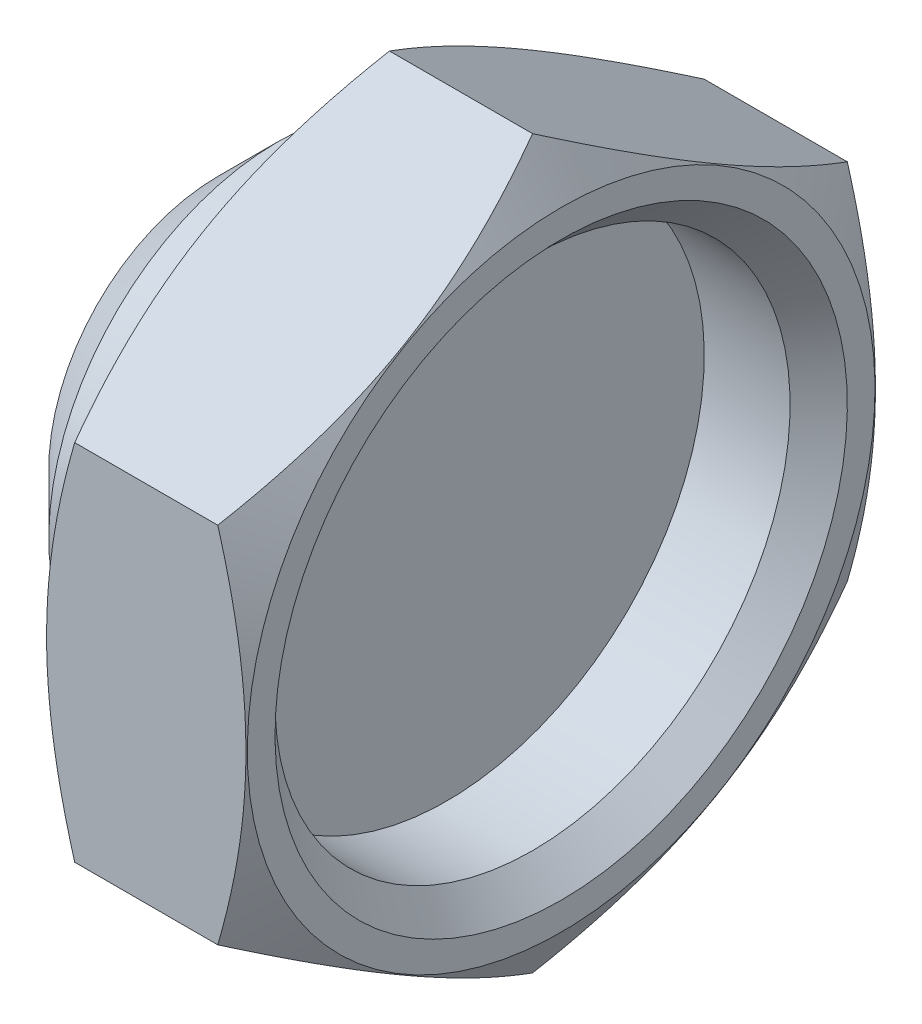
ISO-10303-21;
HEADER;
FILE_DESCRIPTION(('STEP AP214'),'2;1');
FILE_NAME('part.step','',(''),(''),'','','');
FILE_SCHEMA(('AUTOMOTIVE_DESIGN { 1 0 10303 214 1 1 1 1 }'));
ENDSEC;
DATA;
#1=APPLICATION_CONTEXT('core data for automotive mechanical design processes');
#2=APPLICATION_PROTOCOL_DEFINITION('international standard','automotive_design',2000,#1);
#3=PRODUCT_CONTEXT('',#1,'mechanical');
#4=PRODUCT('Part','Part','',(#3));
#5=PRODUCT_RELATED_PRODUCT_CATEGORY('part','',(#4));
#6=PRODUCT_DEFINITION_FORMATION('','',#4);
#7=PRODUCT_DEFINITION_CONTEXT('part definition',#1,'design');
#8=PRODUCT_DEFINITION('design','',#6,#7);
#9=PRODUCT_DEFINITION_SHAPE('','',#8);
#10=(LENGTH_UNIT() NAMED_UNIT(*) SI_UNIT(.MILLI.,.METRE.));
#11=(NAMED_UNIT(*) PLANE_ANGLE_UNIT() SI_UNIT($,.RADIAN.));
#12=(NAMED_UNIT(*) SI_UNIT($,.STERADIAN.) SOLID_ANGLE_UNIT());
#13=UNCERTAINTY_MEASURE_WITH_UNIT(LENGTH_MEASURE(1.E-05),#10,'distance_accuracy_value','');
#14=(GEOMETRIC_REPRESENTATION_CONTEXT(3) GLOBAL_UNCERTAINTY_ASSIGNED_CONTEXT((#13)) GLOBAL_UNIT_ASSIGNED_CONTEXT((#10,
#11,#12)) REPRESENTATION_CONTEXT('',''));
#15=CARTESIAN_POINT('',(0.,0.,0.));
#16=DIRECTION('',(0.,0.,1.));
#17=DIRECTION('',(1.,0.,0.));
#18=AXIS2_PLACEMENT_3D('',#15,#16,#17);
#19=CARTESIAN_POINT('',(-3.5,0.,0.));
#20=DIRECTION('',(1.,0.,0.));
#21=DIRECTION('',(0.,1.,0.));
#22=AXIS2_PLACEMENT_3D('',#19,#20,#21);
#23=CONICAL_SURFACE('',#22,5.48397459621555,1.0471975511966);
#24=CARTESIAN_POINT('',(-3.5,0.,0.));
#25=DIRECTION('',(1.,0.,0.));
#26=DIRECTION('',(0.,1.,0.));
#27=AXIS2_PLACEMENT_3D('',#24,#25,#26);
#28=CIRCLE('',#27,5.48397459621555);
#29=CARTESIAN_POINT('',(-3.5,5.48397459621555,0.));
#30=VERTEX_POINT('',#29);
#31=EDGE_CURVE('E239',#30,#30,#28,.T.);
#32=ORIENTED_EDGE('',*,*,#31,.T.);
#33=EDGE_LOOP('',(#32));
#34=FACE_BOUND('',#33,.T.);
#35=CARTESIAN_POINT('',(-0.860222517226305,-8.4193438078015,5.49926131403115));
#36=CARTESIAN_POINT('',(-0.976894162451002,-8.17790466876837,5.49926131403115));
#37=CARTESIAN_POINT('',(-1.09240561924435,-7.93589454758182,5.49926131403115));
#38=CARTESIAN_POINT('',(-1.32044515697956,-7.45042360911133,5.49926131403116));
#39=CARTESIAN_POINT('',(-1.43297272109457,-7.20696254934565,5.49926131403116));
#40=CARTESIAN_POINT('',(-1.65497454300229,-6.71696524052617,5.49926131403116));
#41=CARTESIAN_POINT('',(-1.76442763135321,-6.47041936552914,5.49926131403116));
#42=CARTESIAN_POINT('',(-1.97863076475805,-5.97530075878895,5.49926131403116));
#43=CARTESIAN_POINT('',(-2.08338105506412,-5.72672813354206,5.49926131403116));
#44=CARTESIAN_POINT('',(-2.2881692769292,-5.2240806083909,5.49926131403116));
#45=CARTESIAN_POINT('',(-2.3881337348326,-4.96997560933001,5.49926131403116));
#46=CARTESIAN_POINT('',(-2.58023034403244,-4.45876779132847,5.49926131403117));
#47=CARTESIAN_POINT('',(-2.67236162377843,-4.20166464241133,5.49926131403117));
#48=CARTESIAN_POINT('',(-2.84631569619457,-3.68458087251413,5.49926131403117));
#49=CARTESIAN_POINT('',(-2.92816041530891,-3.42460770263987,5.49926131403117));
#50=CARTESIAN_POINT('',(-3.07888156914745,-2.90096287239082,5.49926131403117));
#51=CARTESIAN_POINT('',(-3.14776210615687,-2.63729241043142,5.49926131403117));
#52=CARTESIAN_POINT('',(-3.26921381728038,-2.10608510175159,5.49926131403117));
#53=CARTESIAN_POINT('',(-3.32178058367544,-1.83854723051801,5.49926131403118));
#54=CARTESIAN_POINT('',(-3.40705120364587,-1.30020980488695,5.49926131403118));
#55=CARTESIAN_POINT('',(-3.43975503830669,-1.02941024738376,5.49926131403118));
#56=CARTESIAN_POINT('',(-3.47181708617323,-0.622780704300727,5.49926131403118));
#57=CARTESIAN_POINT('',(-3.47967381699046,-0.487586462507965,5.49926131403118));
#58=CARTESIAN_POINT('',(-3.48965869139436,-0.216980373104561,5.49926131403118));
#59=CARTESIAN_POINT('',(-3.49178690924103,-0.0815685283375243,5.49926131403118));
#60=CARTESIAN_POINT('',(-3.49025755488634,0.189183327059158,5.49926131403118));
#61=CARTESIAN_POINT('',(-3.48660160493979,0.324523347184391,5.49926131403118));
#62=CARTESIAN_POINT('',(-3.47359652868538,0.59493180011065,5.49926131403118));
#63=CARTESIAN_POINT('',(-3.46424711852415,0.73000021903384,5.49926131403118));
#64=CARTESIAN_POINT('',(-3.43487817672258,1.0574036937653,5.49926131403119));
#65=CARTESIAN_POINT('',(-3.41200359644678,1.24948678913167,5.49926131403119));
#66=CARTESIAN_POINT('',(-3.35600923475458,1.63218028754172,5.49926131403119));
#67=CARTESIAN_POINT('',(-3.32288665600114,1.82279027390057,5.49926131403119));
#68=CARTESIAN_POINT('',(-3.24757100636626,2.20238051590384,5.49926131403119));
#69=CARTESIAN_POINT('',(-3.20536935624085,2.39135905301,5.49926131403119));
#70=CARTESIAN_POINT('',(-3.11318313045468,2.76737142315785,5.49926131403119));
#71=CARTESIAN_POINT('',(-3.06319928812899,2.95440543766692,5.49926131403119));
#72=CARTESIAN_POINT('',(-2.95533832018987,3.33113367099198,5.49926131403119));
#73=CARTESIAN_POINT('',(-2.8972978015811,3.52078078527209,5.49926131403119));
#74=CARTESIAN_POINT('',(-2.77548463552444,3.8980704136669,5.4992613140312));
#75=CARTESIAN_POINT('',(-2.71171594273515,4.08571421222063,5.4992613140312));
#76=CARTESIAN_POINT('',(-2.57976341412777,4.45824423871632,5.4992613140312));
#77=CARTESIAN_POINT('',(-2.51160645460141,4.64314004377355,5.4992613140312));
#78=CARTESIAN_POINT('',(-2.37129379384592,5.01149734089483,5.4992613140312));
#79=CARTESIAN_POINT('',(-2.29913647542953,5.19495821816797,5.4992613140312));
#80=CARTESIAN_POINT('',(-2.2253747585014,5.37775271726779,5.4992613140312));
#81=B_SPLINE_CURVE_WITH_KNOTS('',3,(#35,#36,#37,#38,#39,#40,#41,#42,#43,#44,#45,#46,#47,#48,#49,
#50,#51,#52,#53,#54,#55,#56,#57,#58,#59,#60,#61,#62,#63,#64,#65,#66,#67,#68,#69,#70,#71,#72,#73,
#74,#75,#76,#77,#78,#79,#80),.UNSPECIFIED.,.F.,.F.,(4,2,2,2,2,2,2,2,2,2,2,2,2,2,2,2,2,2,2,2,2,2,
4),(0.,0.804464769607668,1.60906797871341,2.41827774538096,3.22744526241143,4.04652821302815,
4.86570217912161,5.68309929298247,6.50023731957803,7.31759593193316,8.13495532262018,
8.54111924461276,8.94727790138578,9.35332266518992,9.7593876744355,10.3393855449576,
10.9195418740392,11.5002488472955,12.0809011321908,12.6757805026481,13.2702522869463,
13.8613774537498,14.4527433568325),.UNSPECIFIED.);
#82=CARTESIAN_POINT('',(-2.99999999999999,3.17499999999999,5.49926131403119));
#83=VERTEX_POINT('',#82);
#84=CARTESIAN_POINT('',(-2.99999999999999,-3.17500000000003,5.49926131403117));
#85=VERTEX_POINT('',#84);
#86=EDGE_CURVE('E90',#83,#85,#81,.F.);
#87=ORIENTED_EDGE('',*,*,#86,.F.);
#88=CARTESIAN_POINT('',(-2.99993333151493,6.35011547005384,-0.000199999999999895));
#89=CARTESIAN_POINT('',(-3.04022119966316,6.28032517689997,0.120680333617623));
#90=CARTESIAN_POINT('',(-3.07868069530511,6.21027467153095,0.24201136801264));
#91=CARTESIAN_POINT('',(-3.15143936507394,6.06960477298626,0.485658779387599));
#92=CARTESIAN_POINT('',(-3.18573674449189,5.99898514830378,0.60797555734911));
#93=CARTESIAN_POINT('',(-3.28171252031528,5.78599554726789,0.976884367827086));
#94=CARTESIAN_POINT('',(-3.33630269976675,5.64278482209128,1.22493262002176));
#95=CARTESIAN_POINT('',(-3.40031657213475,5.42847257332278,1.59613232357314));
#96=CARTESIAN_POINT('',(-3.41855236126598,5.35801140654487,1.71817464439306));
#97=CARTESIAN_POINT('',(-3.44913133922799,5.21677068514506,1.96281074995521));
#98=CARTESIAN_POINT('',(-3.46147504870401,5.14599115921264,2.08540448500581));
#99=CARTESIAN_POINT('',(-3.47995528401636,5.00430916848738,2.33080489145946));
#100=CARTESIAN_POINT('',(-3.48609885449138,4.93340693511676,2.45361116202748));
#101=CARTESIAN_POINT('',(-3.49205366681356,4.79154087441145,2.69933038703873));
#102=CARTESIAN_POINT('',(-3.4918651042647,4.7205770490471,2.82224333806923));
#103=CARTESIAN_POINT('',(-3.48264444424823,4.52615642554051,3.15898973602185));
#104=CARTESIAN_POINT('',(-3.46716346768017,4.40276326110671,3.37271296612791));
#105=CARTESIAN_POINT('',(-3.41807192549598,4.15679650457315,3.79873988541694));
#106=CARTESIAN_POINT('',(-3.38444457865597,4.03422377758039,4.01104207619068));
#107=CARTESIAN_POINT('',(-3.30038548532606,3.78776196226402,4.43792646244428));
#108=CARTESIAN_POINT('',(-3.24959756859613,3.66390397476229,4.65245478972052));
#109=CARTESIAN_POINT('',(-3.13432930302382,3.4180351338268,5.07831211421885));
#110=CARTESIAN_POINT('',(-3.06987603241419,3.29602113131975,5.28964656579589));
#111=CARTESIAN_POINT('',(-2.99993333151493,3.17488452994615,5.49946131403119));
#112=B_SPLINE_CURVE_WITH_KNOTS('',3,(#88,#89,#90,#91,#92,#93,#94,#95,#96,#97,#98,#99,#100,#101,
#102,#103,#104,#105,#106,#107,#108,#109,#110,#111),.UNSPECIFIED.,.F.,.F.,(4,2,2,2,2,2,2,2,2,2,2,
4),(0.,0.435800799065846,0.871788853166128,1.74557669465936,2.17176914928739,2.59792393705013,
3.02359397795515,3.44925086963047,4.1902875016232,4.93201059960052,5.69018471432645,
6.44687029946132),.UNSPECIFIED.);
#113=CARTESIAN_POINT('',(-2.99999999999999,6.35,0.));
#114=VERTEX_POINT('',#113);
#115=EDGE_CURVE('E98',#114,#83,#112,.T.);
#116=ORIENTED_EDGE('',*,*,#115,.F.);
#117=CARTESIAN_POINT('',(-2.99993333151493,3.17488452994623,-5.49946131403115));
#118=CARTESIAN_POINT('',(-3.04022119966316,3.24467482310009,-5.37858098041352));
#119=CARTESIAN_POINT('',(-3.07868069530511,3.31472532846911,-5.25724994601851));
#120=CARTESIAN_POINT('',(-3.15143936507394,3.4553952270138,-5.01360253464355));
#121=CARTESIAN_POINT('',(-3.18573674449189,3.52601485169628,-4.89128575668203));
#122=CARTESIAN_POINT('',(-3.28171252031528,3.73900445273217,-4.52237694620406));
#123=CARTESIAN_POINT('',(-3.33630269976674,3.88221517790877,-4.27432869400938));
#124=CARTESIAN_POINT('',(-3.40031657213474,4.09652742667727,-3.903128990458));
#125=CARTESIAN_POINT('',(-3.41855236126597,4.16698859345518,-3.78108666963808));
#126=CARTESIAN_POINT('',(-3.44913133922798,4.30822931485499,-3.53645056407593));
#127=CARTESIAN_POINT('',(-3.461475048704,4.37900884078741,-3.41385682902533));
#128=CARTESIAN_POINT('',(-3.47995528401635,4.52069083151267,-3.16845642257167));
#129=CARTESIAN_POINT('',(-3.48609885449137,4.59159306488329,-3.04565015200365));
#130=CARTESIAN_POINT('',(-3.49205366681355,4.7334591255886,-2.79993092699241));
#131=CARTESIAN_POINT('',(-3.49186510426469,4.80442295095295,-2.67701797596191));
#132=CARTESIAN_POINT('',(-3.48264444424822,4.99884357445953,-2.34027157800928));
#133=CARTESIAN_POINT('',(-3.46716346768015,5.12223673889333,-2.12654834790324));
#134=CARTESIAN_POINT('',(-3.41807192549596,5.36820349542687,-1.70052142861421));
#135=CARTESIAN_POINT('',(-3.38444457865596,5.49077622241963,-1.48821923784048));
#136=CARTESIAN_POINT('',(-3.30038548532605,5.73723803773599,-1.06133485158688));
#137=CARTESIAN_POINT('',(-3.24959756859612,5.86109602523772,-0.846806524310652));
#138=CARTESIAN_POINT('',(-3.13432930302381,6.1069648661732,-0.420949199812329));
#139=CARTESIAN_POINT('',(-3.06987603241419,6.22897886868024,-0.209614748235293));
#140=CARTESIAN_POINT('',(-2.99993333151493,6.35011547005384,0.00019999999999955));
#141=B_SPLINE_CURVE_WITH_KNOTS('',3,(#117,#118,#119,#120,#121,#122,#123,#124,#125,#126,#127,
#128,#129,#130,#131,#132,#133,#134,#135,#136,#137,#138,#139,#140),.UNSPECIFIED.,.F.,.F.,(4,2,2,
2,2,2,2,2,2,2,2,4),(0.,0.435800799065847,0.871788853166128,1.74557669465936,2.17176914928739,
2.59792393705013,3.02359397795515,3.44925086963047,4.19028750162318,4.93201059960048,
5.69018471432639,6.44687029946124),.UNSPECIFIED.);
#142=CARTESIAN_POINT('',(-2.99999999999999,3.17500000000006,-5.49926131403115));
#143=VERTEX_POINT('',#142);
#144=EDGE_CURVE('E199',#143,#114,#141,.T.);
#145=ORIENTED_EDGE('',*,*,#144,.F.);
#146=CARTESIAN_POINT('',(-0.860222517226304,-8.41934380780143,-5.49926131403127));
#147=CARTESIAN_POINT('',(-0.976894162451,-8.1779046687683,-5.49926131403127));
#148=CARTESIAN_POINT('',(-1.09240561924435,-7.93589454758175,-5.49926131403126));
#149=CARTESIAN_POINT('',(-1.32044515697955,-7.45042360911126,-5.49926131403126));
#150=CARTESIAN_POINT('',(-1.43297272109457,-7.20696254934557,-5.49926131403126));
#151=CARTESIAN_POINT('',(-1.65497454300229,-6.7169652405261,-5.49926131403125));
#152=CARTESIAN_POINT('',(-1.76442763135321,-6.47041936552907,-5.49926131403125));
#153=CARTESIAN_POINT('',(-1.97863076475805,-5.97530075878888,-5.49926131403124));
#154=CARTESIAN_POINT('',(-2.08338105506412,-5.72672813354198,-5.49926131403124));
#155=CARTESIAN_POINT('',(-2.28816927692919,-5.22408060839082,-5.49926131403124));
#156=CARTESIAN_POINT('',(-2.38813373483259,-4.96997560932994,-5.49926131403123));
#157=CARTESIAN_POINT('',(-2.58023034403244,-4.45876779132839,-5.49926131403123));
#158=CARTESIAN_POINT('',(-2.67236162377843,-4.20166464241126,-5.49926131403122));
#159=CARTESIAN_POINT('',(-2.84631569619457,-3.68458087251405,-5.49926131403122));
#160=CARTESIAN_POINT('',(-2.9281604153089,-3.4246077026398,-5.49926131403122));
#161=CARTESIAN_POINT('',(-3.07888156914745,-2.90096287239075,-5.49926131403121));
#162=CARTESIAN_POINT('',(-3.14776210615687,-2.63729241043135,-5.49926131403121));
#163=CARTESIAN_POINT('',(-3.26921381728038,-2.10608510175151,-5.4992613140312));
#164=CARTESIAN_POINT('',(-3.32178058367544,-1.83854723051794,-5.4992613140312));
#165=CARTESIAN_POINT('',(-3.40705120364587,-1.30020980488688,-5.4992613140312));
#166=CARTESIAN_POINT('',(-3.43975503830669,-1.02941024738369,-5.49926131403119));
#167=CARTESIAN_POINT('',(-3.47181708617323,-0.622780704300652,-5.49926131403119));
#168=CARTESIAN_POINT('',(-3.47967381699046,-0.48758646250789,-5.49926131403119));
#169=CARTESIAN_POINT('',(-3.48965869139436,-0.216980373104486,-5.49926131403118));
#170=CARTESIAN_POINT('',(-3.49178690924103,-0.0815685283374487,-5.49926131403118));
#171=CARTESIAN_POINT('',(-3.49025755488634,0.189183327059233,-5.49926131403118));
#172=CARTESIAN_POINT('',(-3.48660160493979,0.324523347184466,-5.49926131403118));
#173=CARTESIAN_POINT('',(-3.47359652868538,0.594931800110726,-5.49926131403118));
#174=CARTESIAN_POINT('',(-3.46424711852415,0.730000219033916,-5.49926131403117));
#175=CARTESIAN_POINT('',(-3.43487817672258,1.05740369376537,-5.49926131403117));
#176=CARTESIAN_POINT('',(-3.41200359644678,1.24948678913174,-5.49926131403117));
#177=CARTESIAN_POINT('',(-3.35600923475458,1.63218028754179,-5.49926131403117));
#178=CARTESIAN_POINT('',(-3.32288665600114,1.82279027390064,-5.49926131403116));
#179=CARTESIAN_POINT('',(-3.24757100636626,2.20238051590392,-5.49926131403116));
#180=CARTESIAN_POINT('',(-3.20536935624085,2.39135905301008,-5.49926131403116));
#181=CARTESIAN_POINT('',(-3.11318313045468,2.76737142315792,-5.49926131403115));
#182=CARTESIAN_POINT('',(-3.06319928812899,2.95440543766699,-5.49926131403115));
#183=CARTESIAN_POINT('',(-2.95533832018987,3.33113367099206,-5.49926131403115));
#184=CARTESIAN_POINT('',(-2.8972978015811,3.52078078527217,-5.49926131403114));
#185=CARTESIAN_POINT('',(-2.77548463552444,3.89807041366698,-5.49926131403114));
#186=CARTESIAN_POINT('',(-2.71171594273515,4.08571421222071,-5.49926131403114));
#187=CARTESIAN_POINT('',(-2.57976341412777,4.45824423871639,-5.49926131403114));
#188=CARTESIAN_POINT('',(-2.51160645460141,4.64314004377363,-5.49926131403113));
#189=CARTESIAN_POINT('',(-2.37129379384592,5.0114973408949,-5.49926131403113));
#190=CARTESIAN_POINT('',(-2.29913647542953,5.19495821816804,-5.49926131403113));
#191=CARTESIAN_POINT('',(-2.2253747585014,5.37775271726787,-5.49926131403113));
#192=B_SPLINE_CURVE_WITH_KNOTS('',3,(#146,#147,#148,#149,#150,#151,#152,#153,#154,#155,#156,
#157,#158,#159,#160,#161,#162,#163,#164,#165,#166,#167,#168,#169,#170,#171,#172,#173,#174,#175,
#176,#177,#178,#179,#180,#181,#182,#183,#184,#185,#186,#187,#188,#189,#190,#191),.UNSPECIFIED.,
.F.,.F.,(4,2,2,2,2,2,2,2,2,2,2,2,2,2,2,2,2,2,2,2,2,2,4),(0.,0.804464769607665,1.60906797871341,
2.41827774538096,3.22744526241143,4.04652821302815,4.86570217912161,5.68309929298247,
6.50023731957803,7.31759593193316,8.13495532262019,8.54111924461276,8.94727790138579,
9.35332266518992,9.75938767443551,10.3393855449576,10.9195418740392,11.5002488472955,
12.0809011321908,12.6757805026481,13.2702522869463,13.8613774537498,14.4527433568325),.UNSPECIFIED.);
#193=CARTESIAN_POINT('',(-2.99999999999999,-3.17499999999995,-5.49926131403121));
#194=VERTEX_POINT('',#193);
#195=EDGE_CURVE('E111',#194,#143,#192,.T.);
#196=ORIENTED_EDGE('',*,*,#195,.F.);
#197=CARTESIAN_POINT('',(-2.99993333151493,-6.35011547005384,0.000199999999955765));
#198=CARTESIAN_POINT('',(-3.04022119966316,-6.28032517689997,-0.120680333617667));
#199=CARTESIAN_POINT('',(-3.0786806953051,-6.21027467153095,-0.242011368012683));
#200=CARTESIAN_POINT('',(-3.15143936507394,-6.06960477298626,-0.485658779387641));
#201=CARTESIAN_POINT('',(-3.18573674449189,-5.99898514830377,-0.607975557349151));
#202=CARTESIAN_POINT('',(-3.28171252031528,-5.78599554726789,-0.976884367827126));
#203=CARTESIAN_POINT('',(-3.33630269976674,-5.64278482209127,-1.2249326200218));
#204=CARTESIAN_POINT('',(-3.40031657213475,-5.42847257332277,-1.59613232357318));
#205=CARTESIAN_POINT('',(-3.41855236126598,-5.35801140654486,-1.7181746443931));
#206=CARTESIAN_POINT('',(-3.44913133922799,-5.21677068514505,-1.96281074995525));
#207=CARTESIAN_POINT('',(-3.46147504870401,-5.14599115921263,-2.08540448500584));
#208=CARTESIAN_POINT('',(-3.47995528401636,-5.00430916848736,-2.3308048914595));
#209=CARTESIAN_POINT('',(-3.48609885449137,-4.93340693511674,-2.45361116202752));
#210=CARTESIAN_POINT('',(-3.49205366681356,-4.79154087441143,-2.69933038703876));
#211=CARTESIAN_POINT('',(-3.4918651042647,-4.72057704904708,-2.82224333806926));
#212=CARTESIAN_POINT('',(-3.48264444424823,-4.52615642554049,-3.15898973602189));
#213=CARTESIAN_POINT('',(-3.46716346768017,-4.40276326110668,-3.37271296612794));
#214=CARTESIAN_POINT('',(-3.41807192549598,-4.15679650457313,-3.79873988541697));
#215=CARTESIAN_POINT('',(-3.38444457865597,-4.03422377758036,-4.01104207619071));
#216=CARTESIAN_POINT('',(-3.30038548532606,-3.78776196226399,-4.43792646244431));
#217=CARTESIAN_POINT('',(-3.24959756859613,-3.66390397476225,-4.65245478972055));
#218=CARTESIAN_POINT('',(-3.13432930302381,-3.41803513382676,-5.07831211421888));
#219=CARTESIAN_POINT('',(-3.06987603241419,-3.29602113131972,-5.28964656579592));
#220=CARTESIAN_POINT('',(-2.99993333151493,-3.17488452994611,-5.49946131403121));
#221=B_SPLINE_CURVE_WITH_KNOTS('',3,(#197,#198,#199,#200,#201,#202,#203,#204,#205,#206,#207,
#208,#209,#210,#211,#212,#213,#214,#215,#216,#217,#218,#219,#220),.UNSPECIFIED.,.F.,.F.,(4,2,2,
2,2,2,2,2,2,2,2,4),(0.,0.435800799065845,0.871788853166127,1.74557669465936,2.17176914928739,
2.59792393705013,3.02359397795515,3.44925086963047,4.1902875016232,4.93201059960052,
5.69018471432645,6.44687029946132),.UNSPECIFIED.);
#222=CARTESIAN_POINT('',(-2.99999999999999,-6.35,0.));
#223=VERTEX_POINT('',#222);
#224=EDGE_CURVE('E181',#223,#194,#221,.T.);
#225=ORIENTED_EDGE('',*,*,#224,.F.);
#226=CARTESIAN_POINT('',(-2.99993333151493,-3.17488452994619,5.49946131403117));
#227=CARTESIAN_POINT('',(-3.04022119966316,-3.24467482310005,5.37858098041355));
#228=CARTESIAN_POINT('',(-3.07868069530511,-3.31472532846907,5.25724994601853));
#229=CARTESIAN_POINT('',(-3.15143936507394,-3.45539522701376,5.01360253464357));
#230=CARTESIAN_POINT('',(-3.18573674449189,-3.52601485169624,4.89128575668206));
#231=CARTESIAN_POINT('',(-3.28171252031528,-3.73900445273213,4.52237694620408));
#232=CARTESIAN_POINT('',(-3.33630269976674,-3.88221517790874,4.27432869400941));
#233=CARTESIAN_POINT('',(-3.40031657213475,-4.09652742667723,3.90312899045803));
#234=CARTESIAN_POINT('',(-3.41855236126598,-4.16698859345514,3.7810866696381));
#235=CARTESIAN_POINT('',(-3.44913133922799,-4.30822931485495,3.53645056407595));
#236=CARTESIAN_POINT('',(-3.46147504870401,-4.37900884078737,3.41385682902535));
#237=CARTESIAN_POINT('',(-3.47995528401636,-4.52069083151263,3.1684564225717));
#238=CARTESIAN_POINT('',(-3.48609885449138,-4.59159306488325,3.04565015200368));
#239=CARTESIAN_POINT('',(-3.49205366681356,-4.73345912558856,2.79993092699243));
#240=CARTESIAN_POINT('',(-3.4918651042647,-4.80442295095291,2.67701797596193));
#241=CARTESIAN_POINT('',(-3.48264444424823,-4.99884357445949,2.3402715780093));
#242=CARTESIAN_POINT('',(-3.46716346768017,-5.1222367388933,2.12654834790325));
#243=CARTESIAN_POINT('',(-3.41807192549598,-5.36820349542685,1.70052142861421));
#244=CARTESIAN_POINT('',(-3.38444457865597,-5.49077622241961,1.48821923784048));
#245=CARTESIAN_POINT('',(-3.30038548532606,-5.73723803773597,1.06133485158687));
#246=CARTESIAN_POINT('',(-3.24959756859613,-5.86109602523771,0.84680652431063));
#247=CARTESIAN_POINT('',(-3.13432930302381,-6.10696486617319,0.420949199812295));
#248=CARTESIAN_POINT('',(-3.06987603241419,-6.22897886868024,0.209614748235254));
#249=CARTESIAN_POINT('',(-2.99993333151493,-6.35011547005384,-0.000200000000044996));
#250=B_SPLINE_CURVE_WITH_KNOTS('',3,(#226,#227,#228,#229,#230,#231,#232,#233,#234,#235,#236,
#237,#238,#239,#240,#241,#242,#243,#244,#245,#246,#247,#248,#249),.UNSPECIFIED.,.F.,.F.,(4,2,2,
2,2,2,2,2,2,2,2,4),(0.,0.435800799065844,0.871788853166127,1.74557669465936,2.17176914928739,
2.59792393705013,3.02359397795515,3.44925086963047,4.1902875016232,4.93201059960052,
5.69018471432645,6.44687029946132),.UNSPECIFIED.);
#251=EDGE_CURVE('E107',#85,#223,#250,.T.);
#252=ORIENTED_EDGE('',*,*,#251,.F.);
#253=EDGE_LOOP('',(#87,#116,#145,#196,#225,#252));
#254=FACE_BOUND('',#253,.T.);
#255=ADVANCED_FACE('F35',(#34,#254),#23,.T.);
#256=CARTESIAN_POINT('',(-0.500000000000001,0.,0.));
#257=DIRECTION('',(-1.,0.,0.));
#258=DIRECTION('',(0.,-1.,0.));
#259=AXIS2_PLACEMENT_3D('',#256,#257,#258);
#260=CONICAL_SURFACE('',#259,6.35,1.0471975511966);
#261=CARTESIAN_POINT('',(0.,0.,0.));
#262=DIRECTION('',(1.,0.,0.));
#263=DIRECTION('',(0.,1.,0.));
#264=AXIS2_PLACEMENT_3D('',#261,#262,#263);
#265=CIRCLE('',#264,5.48397459621555);
#266=CARTESIAN_POINT('',(0.,5.48397459621555,0.));
#267=VERTEX_POINT('',#266);
#268=EDGE_CURVE('E242',#267,#267,#265,.T.);
#269=ORIENTED_EDGE('',*,*,#268,.F.);
#270=EDGE_LOOP('',(#269));
#271=FACE_BOUND('',#270,.T.);
#272=CARTESIAN_POINT('',(-2.63977748277365,-8.4193438078015,5.49926131403115));
#273=CARTESIAN_POINT('',(-2.52310583754896,-8.17790466876837,5.49926131403115));
#274=CARTESIAN_POINT('',(-2.40759438075561,-7.93589454758183,5.49926131403115));
#275=CARTESIAN_POINT('',(-2.17955484302041,-7.45042360911133,5.49926131403116));
#276=CARTESIAN_POINT('',(-2.06702727890539,-7.20696254934565,5.49926131403116));
#277=CARTESIAN_POINT('',(-1.84502545699768,-6.71696524052617,5.49926131403116));
#278=CARTESIAN_POINT('',(-1.73557236864676,-6.47041936552914,5.49926131403116));
#279=CARTESIAN_POINT('',(-1.52136923524192,-5.97530075878895,5.49926131403116));
#280=CARTESIAN_POINT('',(-1.41661894493586,-5.72672813354205,5.49926131403116));
#281=CARTESIAN_POINT('',(-1.21183072307078,-5.22408060839089,5.49926131403116));
#282=CARTESIAN_POINT('',(-1.11186626516738,-4.96997560933001,5.49926131403116));
#283=CARTESIAN_POINT('',(-0.919769655967547,-4.45876779132846,5.49926131403117));
#284=CARTESIAN_POINT('',(-0.827638376221558,-4.20166464241133,5.49926131403117));
#285=CARTESIAN_POINT('',(-0.653684303805419,-3.68458087251413,5.49926131403117));
#286=CARTESIAN_POINT('',(-0.571839584691085,-3.42460770263987,5.49926131403117));
#287=CARTESIAN_POINT('',(-0.421118430852542,-2.90096287239082,5.49926131403117));
#288=CARTESIAN_POINT('',(-0.35223789384312,-2.63729241043142,5.49926131403117));
#289=CARTESIAN_POINT('',(-0.230786182719616,-2.10608510175159,5.49926131403117));
#290=CARTESIAN_POINT('',(-0.178219416324561,-1.83854723051801,5.49926131403118));
#291=CARTESIAN_POINT('',(-0.0929487963541297,-1.30020980488696,5.49926131403118));
#292=CARTESIAN_POINT('',(-0.0602449616933108,-1.02941024738377,5.49926131403118));
#293=CARTESIAN_POINT('',(-0.028182913826768,-0.622780704300733,5.49926131403118));
#294=CARTESIAN_POINT('',(-0.0203261830095407,-0.487586462507971,5.49926131403118));
#295=CARTESIAN_POINT('',(-0.0103413086056419,-0.216980373104568,5.49926131403118));
#296=CARTESIAN_POINT('',(-0.00821309075896969,-0.081568528337532,5.49926131403118));
#297=CARTESIAN_POINT('',(-0.00974244511366106,0.189183327059149,5.49926131403118));
#298=CARTESIAN_POINT('',(-0.0133983950602101,0.324523347184382,5.49926131403118));
#299=CARTESIAN_POINT('',(-0.0264034713146173,0.594931800110642,5.49926131403118));
#300=CARTESIAN_POINT('',(-0.0357528814758546,0.730000219033832,5.49926131403118));
#301=CARTESIAN_POINT('',(-0.065121823277417,1.05740369376529,5.49926131403119));
#302=CARTESIAN_POINT('',(-0.087996403553221,1.24948678913167,5.49926131403119));
#303=CARTESIAN_POINT('',(-0.143990765245416,1.63218028754173,5.49926131403119));
#304=CARTESIAN_POINT('',(-0.177113343998859,1.82279027390058,5.49926131403119));
#305=CARTESIAN_POINT('',(-0.25242899363374,2.20238051590386,5.49926131403119));
#306=CARTESIAN_POINT('',(-0.294630643759152,2.39135905301003,5.49926131403119));
#307=CARTESIAN_POINT('',(-0.386816869545329,2.76737142315788,5.49926131403119));
#308=CARTESIAN_POINT('',(-0.436800711871017,2.95440543766695,5.49926131403119));
#309=CARTESIAN_POINT('',(-0.544661679810134,3.33113367099202,5.49926131403119));
#310=CARTESIAN_POINT('',(-0.602702198418907,3.52078078527214,5.49926131403119));
#311=CARTESIAN_POINT('',(-0.724515364475567,3.89807041366695,5.4992613140312));
#312=CARTESIAN_POINT('',(-0.788284057264855,4.08571421222069,5.4992613140312));
#313=CARTESIAN_POINT('',(-0.920236585872237,4.45824423871638,5.4992613140312));
#314=CARTESIAN_POINT('',(-0.988393545398601,4.64314004377362,5.4992613140312));
#315=CARTESIAN_POINT('',(-1.12870620615409,5.0114973408949,5.4992613140312));
#316=CARTESIAN_POINT('',(-1.20086352457048,5.19495821816805,5.4992613140312));
#317=CARTESIAN_POINT('',(-1.27462524149861,5.37775271726787,5.4992613140312));
#318=B_SPLINE_CURVE_WITH_KNOTS('',3,(#272,#273,#274,#275,#276,#277,#278,#279,#280,#281,#282,
#283,#284,#285,#286,#287,#288,#289,#290,#291,#292,#293,#294,#295,#296,#297,#298,#299,#300,#301,
#302,#303,#304,#305,#306,#307,#308,#309,#310,#311,#312,#313,#314,#315,#316,#317),.UNSPECIFIED.,
.F.,.F.,(4,2,2,2,2,2,2,2,2,2,2,2,2,2,2,2,2,2,2,2,2,2,4),(0.,0.804464769607666,1.60906797871341,
2.41827774538095,3.22744526241142,4.04652821302815,4.8657021791216,5.68309929298246,
6.50023731957802,7.31759593193315,8.13495532262017,8.54111924461274,8.94727790138576,
9.3533226651899,9.75938767443548,10.3393855449576,10.9195418740392,11.5002488472955,
12.0809011321908,12.6757805026481,13.2702522869464,13.8613774537499,14.4527433568325),.UNSPECIFIED.);
#319=CARTESIAN_POINT('',(-0.5,-3.17500000000003,5.49926131403117));
#320=VERTEX_POINT('',#319);
#321=CARTESIAN_POINT('',(-0.5,3.17499999999999,5.49926131403119));
#322=VERTEX_POINT('',#321);
#323=EDGE_CURVE('E93',#320,#322,#318,.T.);
#324=ORIENTED_EDGE('',*,*,#323,.F.);
#325=CARTESIAN_POINT('',(-0.500066668485059,-6.35011547005384,-0.000200000000044009));
#326=CARTESIAN_POINT('',(-0.459778800336836,-6.28032517689997,0.12068033361758));
#327=CARTESIAN_POINT('',(-0.421319304694887,-6.21027467153095,0.242011368012597));
#328=CARTESIAN_POINT('',(-0.34856063492605,-6.06960477298627,0.485658779387557));
#329=CARTESIAN_POINT('',(-0.314263255508105,-5.99898514830378,0.607975557349068));
#330=CARTESIAN_POINT('',(-0.218287479684717,-5.7859955472679,0.976884367827043));
#331=CARTESIAN_POINT('',(-0.163697300233252,-5.64278482209129,1.22493262002172));
#332=CARTESIAN_POINT('',(-0.0996834278652517,-5.4284725733228,1.5961323235731));
#333=CARTESIAN_POINT('',(-0.0814476387340225,-5.35801140654489,1.71817464439302));
#334=CARTESIAN_POINT('',(-0.0508686607720121,-5.21677068514508,1.96281074995517));
#335=CARTESIAN_POINT('',(-0.0385249512959862,-5.14599115921266,2.08540448500577));
#336=CARTESIAN_POINT('',(-0.0200447159836397,-5.0043091684874,2.33080489145942));
#337=CARTESIAN_POINT('',(-0.0139011455086242,-4.93340693511678,2.45361116202744));
#338=CARTESIAN_POINT('',(-0.00794633318643829,-4.79154087441147,2.69933038703869));
#339=CARTESIAN_POINT('',(-0.00813489573530194,-4.72057704904712,2.82224333806919));
#340=CARTESIAN_POINT('',(-0.0173555557517673,-4.52615642554054,3.15898973602182));
#341=CARTESIAN_POINT('',(-0.0328365323198312,-4.40276326110673,3.37271296612787));
#342=CARTESIAN_POINT('',(-0.0819280745040209,-4.15679650457318,3.79873988541691));
#343=CARTESIAN_POINT('',(-0.115555421344029,-4.03422377758042,4.01104207619065));
#344=CARTESIAN_POINT('',(-0.199614514673933,-3.78776196226405,4.43792646244426));
#345=CARTESIAN_POINT('',(-0.250402431403868,-3.66390397476232,4.65245478972049));
#346=CARTESIAN_POINT('',(-0.365670696976179,-3.41803513382683,5.07831211421883));
#347=CARTESIAN_POINT('',(-0.430123967585804,-3.29602113131979,5.28964656579587));
#348=CARTESIAN_POINT('',(-0.500066668485059,-3.17488452994619,5.49946131403117));
#349=B_SPLINE_CURVE_WITH_KNOTS('',3,(#325,#326,#327,#328,#329,#330,#331,#332,#333,#334,#335,
#336,#337,#338,#339,#340,#341,#342,#343,#344,#345,#346,#347,#348),.UNSPECIFIED.,.F.,.F.,(4,2,2,
2,2,2,2,2,2,2,2,4),(0.,0.435800799065845,0.871788853166126,1.74557669465935,2.17176914928738,
2.59792393705012,3.02359397795514,3.44925086963046,4.19028750162319,4.93201059960051,
5.69018471432645,6.44687029946132),.UNSPECIFIED.);
#350=CARTESIAN_POINT('',(-0.5,-6.35,0.));
#351=VERTEX_POINT('',#350);
#352=EDGE_CURVE('E166',#351,#320,#349,.T.);
#353=ORIENTED_EDGE('',*,*,#352,.F.);
#354=CARTESIAN_POINT('',(-0.500066668485059,-3.17488452994611,-5.49946131403121));
#355=CARTESIAN_POINT('',(-0.459778800336836,-3.24467482309998,-5.37858098041359));
#356=CARTESIAN_POINT('',(-0.421319304694887,-3.314725328469,-5.25724994601857));
#357=CARTESIAN_POINT('',(-0.34856063492605,-3.45539522701369,-5.01360253464362));
#358=CARTESIAN_POINT('',(-0.314263255508106,-3.52601485169618,-4.89128575668211));
#359=CARTESIAN_POINT('',(-0.218287479684717,-3.73900445273206,-4.52237694620413));
#360=CARTESIAN_POINT('',(-0.163697300233252,-3.88221517790868,-4.27432869400946));
#361=CARTESIAN_POINT('',(-0.0996834278652518,-4.09652742667718,-3.90312899045809));
#362=CARTESIAN_POINT('',(-0.0814476387340228,-4.16698859345509,-3.78108666963816));
#363=CARTESIAN_POINT('',(-0.0508686607720126,-4.3082293148549,-3.53645056407601));
#364=CARTESIAN_POINT('',(-0.0385249512959867,-4.37900884078732,-3.41385682902542));
#365=CARTESIAN_POINT('',(-0.0200447159836401,-4.52069083151258,-3.16845642257176));
#366=CARTESIAN_POINT('',(-0.0139011455086245,-4.59159306488321,-3.04565015200374));
#367=CARTESIAN_POINT('',(-0.00794633318643863,-4.73345912558852,-2.7999309269925));
#368=CARTESIAN_POINT('',(-0.00813489573530237,-4.80442295095287,-2.677017975962));
#369=CARTESIAN_POINT('',(-0.0173555557517679,-4.99884357445946,-2.34027157800938));
#370=CARTESIAN_POINT('',(-0.0328365323198317,-5.12223673889326,-2.12654834790333));
#371=CARTESIAN_POINT('',(-0.0819280745040215,-5.36820349542682,-1.70052142861429));
#372=CARTESIAN_POINT('',(-0.11555542134403,-5.49077622241959,-1.48821923784055));
#373=CARTESIAN_POINT('',(-0.199614514673934,-5.73723803773596,-1.06133485158695));
#374=CARTESIAN_POINT('',(-0.250402431403869,-5.8610960252377,-0.846806524310713));
#375=CARTESIAN_POINT('',(-0.36567069697618,-6.10696486617319,-0.420949199812382));
#376=CARTESIAN_POINT('',(-0.430123967585804,-6.22897886868023,-0.209614748235342));
#377=CARTESIAN_POINT('',(-0.50006666848506,-6.35011547005384,0.000199999999955828));
#378=B_SPLINE_CURVE_WITH_KNOTS('',3,(#354,#355,#356,#357,#358,#359,#360,#361,#362,#363,#364,
#365,#366,#367,#368,#369,#370,#371,#372,#373,#374,#375,#376,#377),.UNSPECIFIED.,.F.,.F.,(4,2,2,
2,2,2,2,2,2,2,2,4),(0.,0.435800799065845,0.871788853166125,1.74557669465935,2.17176914928738,
2.59792393705012,3.02359397795514,3.44925086963046,4.19028750162319,4.93201059960051,
5.69018471432645,6.44687029946132),.UNSPECIFIED.);
#379=CARTESIAN_POINT('',(-0.5,-3.17499999999995,-5.49926131403121));
#380=VERTEX_POINT('',#379);
#381=EDGE_CURVE('E58',#380,#351,#378,.T.);
#382=ORIENTED_EDGE('',*,*,#381,.F.);
#383=CARTESIAN_POINT('',(-2.63977748277365,-8.41934380780143,-5.49926131403127));
#384=CARTESIAN_POINT('',(-2.52310583754896,-8.1779046687683,-5.49926131403127));
#385=CARTESIAN_POINT('',(-2.40759438075561,-7.93589454758176,-5.49926131403126));
#386=CARTESIAN_POINT('',(-2.17955484302041,-7.45042360911126,-5.49926131403126));
#387=CARTESIAN_POINT('',(-2.06702727890539,-7.20696254934557,-5.49926131403126));
#388=CARTESIAN_POINT('',(-1.84502545699768,-6.7169652405261,-5.49926131403125));
#389=CARTESIAN_POINT('',(-1.73557236864676,-6.47041936552907,-5.49926131403125));
#390=CARTESIAN_POINT('',(-1.52136923524192,-5.97530075878888,-5.49926131403124));
#391=CARTESIAN_POINT('',(-1.41661894493586,-5.72672813354198,-5.49926131403124));
#392=CARTESIAN_POINT('',(-1.21183072307078,-5.22408060839082,-5.49926131403124));
#393=CARTESIAN_POINT('',(-1.11186626516739,-4.96997560932994,-5.49926131403123));
#394=CARTESIAN_POINT('',(-0.919769655967549,-4.45876779132839,-5.49926131403123));
#395=CARTESIAN_POINT('',(-0.827638376221559,-4.20166464241126,-5.49926131403122));
#396=CARTESIAN_POINT('',(-0.65368430380542,-3.68458087251405,-5.49926131403122));
#397=CARTESIAN_POINT('',(-0.571839584691086,-3.4246077026398,-5.49926131403122));
#398=CARTESIAN_POINT('',(-0.421118430852543,-2.90096287239075,-5.49926131403121));
#399=CARTESIAN_POINT('',(-0.352237893843121,-2.63729241043135,-5.49926131403121));
#400=CARTESIAN_POINT('',(-0.230786182719616,-2.10608510175151,-5.4992613140312));
#401=CARTESIAN_POINT('',(-0.178219416324562,-1.83854723051794,-5.4992613140312));
#402=CARTESIAN_POINT('',(-0.0929487963541298,-1.30020980488688,-5.4992613140312));
#403=CARTESIAN_POINT('',(-0.0602449616933111,-1.02941024738369,-5.49926131403119));
#404=CARTESIAN_POINT('',(-0.028182913826768,-0.622780704300657,-5.49926131403119));
#405=CARTESIAN_POINT('',(-0.0203261830095405,-0.487586462507896,-5.49926131403119));
#406=CARTESIAN_POINT('',(-0.0103413086056417,-0.216980373104492,-5.49926131403118));
#407=CARTESIAN_POINT('',(-0.0082130907589697,-0.081568528337455,-5.49926131403118));
#408=CARTESIAN_POINT('',(-0.00974244511366107,0.189183327059227,-5.49926131403118));
#409=CARTESIAN_POINT('',(-0.0133983950602099,0.32452334718446,-5.49926131403118));
#410=CARTESIAN_POINT('',(-0.0264034713146171,0.594931800110719,-5.49926131403118));
#411=CARTESIAN_POINT('',(-0.0357528814758545,0.730000219033908,-5.49926131403117));
#412=CARTESIAN_POINT('',(-0.0651218232774172,1.05740369376537,-5.49926131403117));
#413=CARTESIAN_POINT('',(-0.0879964035532212,1.24948678913174,-5.49926131403117));
#414=CARTESIAN_POINT('',(-0.143990765245416,1.6321802875418,-5.49926131403117));
#415=CARTESIAN_POINT('',(-0.177113343998859,1.82279027390065,-5.49926131403116));
#416=CARTESIAN_POINT('',(-0.252428993633739,2.20238051590393,-5.49926131403116));
#417=CARTESIAN_POINT('',(-0.294630643759151,2.3913590530101,-5.49926131403116));
#418=CARTESIAN_POINT('',(-0.386816869545328,2.76737142315795,-5.49926131403115));
#419=CARTESIAN_POINT('',(-0.436800711871016,2.95440543766702,-5.49926131403115));
#420=CARTESIAN_POINT('',(-0.544661679810132,3.3311336709921,-5.49926131403115));
#421=CARTESIAN_POINT('',(-0.602702198418905,3.52078078527221,-5.49926131403114));
#422=CARTESIAN_POINT('',(-0.724515364475566,3.89807041366703,-5.49926131403114));
#423=CARTESIAN_POINT('',(-0.788284057264854,4.08571421222076,-5.49926131403114));
#424=CARTESIAN_POINT('',(-0.920236585872237,4.45824423871645,-5.49926131403114));
#425=CARTESIAN_POINT('',(-0.988393545398601,4.64314004377369,-5.49926131403113));
#426=CARTESIAN_POINT('',(-1.12870620615409,5.01149734089497,-5.49926131403113));
#427=CARTESIAN_POINT('',(-1.20086352457048,5.19495821816812,-5.49926131403113));
#428=CARTESIAN_POINT('',(-1.27462524149861,5.37775271726795,-5.49926131403113));
#429=B_SPLINE_CURVE_WITH_KNOTS('',3,(#383,#384,#385,#386,#387,#388,#389,#390,#391,#392,#393,
#394,#395,#396,#397,#398,#399,#400,#401,#402,#403,#404,#405,#406,#407,#408,#409,#410,#411,#412,
#413,#414,#415,#416,#417,#418,#419,#420,#421,#422,#423,#424,#425,#426,#427,#428),.UNSPECIFIED.,
.F.,.F.,(4,2,2,2,2,2,2,2,2,2,2,2,2,2,2,2,2,2,2,2,2,2,4),(0.,0.804464769607664,1.60906797871341,
2.41827774538095,3.22744526241142,4.04652821302814,4.8657021791216,5.68309929298246,
6.50023731957802,7.31759593193315,8.13495532262017,8.54111924461274,8.94727790138577,
9.3533226651899,9.75938767443548,10.3393855449576,10.9195418740392,11.5002488472955,
12.0809011321908,12.6757805026481,13.2702522869464,13.8613774537499,14.4527433568325),.UNSPECIFIED.);
#430=CARTESIAN_POINT('',(-0.500000000000001,3.17500000000006,-5.49926131403115));
#431=VERTEX_POINT('',#430);
#432=EDGE_CURVE('E148',#431,#380,#429,.F.);
#433=ORIENTED_EDGE('',*,*,#432,.F.);
#434=CARTESIAN_POINT('',(-0.500066668485061,6.35011547005384,0.0002));
#435=CARTESIAN_POINT('',(-0.459778800336838,6.28032517689997,-0.120680333617624));
#436=CARTESIAN_POINT('',(-0.42131930469489,6.21027467153095,-0.242011368012641));
#437=CARTESIAN_POINT('',(-0.348560634926053,6.06960477298627,-0.485658779387601));
#438=CARTESIAN_POINT('',(-0.31426325550811,5.99898514830378,-0.607975557349112));
#439=CARTESIAN_POINT('',(-0.218287479684723,5.7859955472679,-0.976884367827088));
#440=CARTESIAN_POINT('',(-0.163697300233259,5.64278482209129,-1.22493262002176));
#441=CARTESIAN_POINT('',(-0.0996834278652603,5.4284725733228,-1.59613232357314));
#442=CARTESIAN_POINT('',(-0.0814476387340319,5.35801140654489,-1.71817464439307));
#443=CARTESIAN_POINT('',(-0.0508686607720228,5.21677068514508,-1.96281074995522));
#444=CARTESIAN_POINT('',(-0.0385249512959975,5.14599115921266,-2.08540448500581));
#445=CARTESIAN_POINT('',(-0.020044715983652,5.0043091684874,-2.33080489145947));
#446=CARTESIAN_POINT('',(-0.0139011455086369,4.93340693511678,-2.45361116202749));
#447=CARTESIAN_POINT('',(-0.00794633318645221,4.79154087441147,-2.69933038703873));
#448=CARTESIAN_POINT('',(-0.00813489573531666,4.72057704904712,-2.82224333806923));
#449=CARTESIAN_POINT('',(-0.0173555557517837,4.52615642554054,-3.15898973602186));
#450=CARTESIAN_POINT('',(-0.0328365323198477,4.40276326110674,-3.3727129661279));
#451=CARTESIAN_POINT('',(-0.0819280745040367,4.15679650457319,-3.79873988541693));
#452=CARTESIAN_POINT('',(-0.115555421344045,4.03422377758044,-4.01104207619067));
#453=CARTESIAN_POINT('',(-0.199614514673946,3.78776196226408,-4.43792646244426));
#454=CARTESIAN_POINT('',(-0.250402431403879,3.66390397476235,-4.65245478972049));
#455=CARTESIAN_POINT('',(-0.365670696976186,3.41803513382687,-5.07831211421882));
#456=CARTESIAN_POINT('',(-0.430123967585808,3.29602113131983,-5.28964656579585));
#457=CARTESIAN_POINT('',(-0.50006666848506,3.17488452994623,-5.49946131403115));
#458=B_SPLINE_CURVE_WITH_KNOTS('',3,(#434,#435,#436,#437,#438,#439,#440,#441,#442,#443,#444,
#445,#446,#447,#448,#449,#450,#451,#452,#453,#454,#455,#456,#457),.UNSPECIFIED.,.F.,.F.,(4,2,2,
2,2,2,2,2,2,2,2,4),(0.,0.435800799065844,0.871788853166125,1.74557669465935,2.17176914928738,
2.59792393705012,3.02359397795514,3.44925086963046,4.19028750162317,4.93201059960048,
5.69018471432639,6.44687029946124),.UNSPECIFIED.);
#459=CARTESIAN_POINT('',(-0.500000000000002,6.35,0.));
#460=VERTEX_POINT('',#459);
#461=EDGE_CURVE('E50',#460,#431,#458,.T.);
#462=ORIENTED_EDGE('',*,*,#461,.F.);
#463=CARTESIAN_POINT('',(-0.500066668485061,3.17488452994615,5.49946131403119));
#464=CARTESIAN_POINT('',(-0.459778800336837,3.24467482310002,5.37858098041357));
#465=CARTESIAN_POINT('',(-0.421319304694889,3.31472532846904,5.25724994601855));
#466=CARTESIAN_POINT('',(-0.348560634926051,3.45539522701372,5.01360253464359));
#467=CARTESIAN_POINT('',(-0.314263255508107,3.52601485169621,4.89128575668208));
#468=CARTESIAN_POINT('',(-0.218287479684719,3.73900445273209,4.52237694620411));
#469=CARTESIAN_POINT('',(-0.163697300233254,3.88221517790871,4.27432869400944));
#470=CARTESIAN_POINT('',(-0.099683427865253,4.0965274266772,3.90312899045806));
#471=CARTESIAN_POINT('',(-0.0814476387340238,4.16698859345511,3.78108666963813));
#472=CARTESIAN_POINT('',(-0.0508686607720139,4.30822931485492,3.53645056407598));
#473=CARTESIAN_POINT('',(-0.0385249512959883,4.37900884078735,3.41385682902539));
#474=CARTESIAN_POINT('',(-0.0200447159836418,4.52069083151261,3.16845642257173));
#475=CARTESIAN_POINT('',(-0.013901145508626,4.59159306488323,3.04565015200371));
#476=CARTESIAN_POINT('',(-0.00794633318644008,4.73345912558853,2.79993092699247));
#477=CARTESIAN_POINT('',(-0.00813489573530407,4.80442295095289,2.67701797596197));
#478=CARTESIAN_POINT('',(-0.0173555557517699,4.99884357445947,2.34027157800934));
#479=CARTESIAN_POINT('',(-0.0328365323198334,5.12223673889328,2.12654834790329));
#480=CARTESIAN_POINT('',(-0.081928074504023,5.36820349542683,1.70052142861425));
#481=CARTESIAN_POINT('',(-0.115555421344032,5.4907762224196,1.48821923784052));
#482=CARTESIAN_POINT('',(-0.199614514673936,5.73723803773597,1.06133485158691));
#483=CARTESIAN_POINT('',(-0.250402431403871,5.8610960252377,0.846806524310672));
#484=CARTESIAN_POINT('',(-0.365670696976182,6.10696486617319,0.420949199812339));
#485=CARTESIAN_POINT('',(-0.430123967585806,6.22897886868024,0.209614748235298));
#486=CARTESIAN_POINT('',(-0.500066668485062,6.35011547005384,-0.000200000000000155));
#487=B_SPLINE_CURVE_WITH_KNOTS('',3,(#463,#464,#465,#466,#467,#468,#469,#470,#471,#472,#473,
#474,#475,#476,#477,#478,#479,#480,#481,#482,#483,#484,#485,#486),.UNSPECIFIED.,.F.,.F.,(4,2,2,
2,2,2,2,2,2,2,2,4),(0.,0.435800799065843,0.871788853166125,1.74557669465935,2.17176914928738,
2.59792393705012,3.02359397795514,3.44925086963046,4.19028750162319,4.93201059960052,
5.69018471432645,6.44687029946132),.UNSPECIFIED.);
#488=EDGE_CURVE('E142',#322,#460,#487,.T.);
#489=ORIENTED_EDGE('',*,*,#488,.F.);
#490=EDGE_LOOP('',(#324,#353,#382,#433,#462,#489));
#491=FACE_BOUND('',#490,.T.);
#492=ADVANCED_FACE('F155',(#271,#491),#260,.T.);
#493=CARTESIAN_POINT('',(0.,-5.48397459621555,0.));
#494=DIRECTION('',(-1.,0.,0.));
#495=DIRECTION('',(0.,-1.,0.));
#496=AXIS2_PLACEMENT_3D('',#493,#494,#495);
#497=PLANE('',#496);
#498=CARTESIAN_POINT('',(0.,0.,0.));
#499=DIRECTION('',(-1.,0.,0.));
#500=DIRECTION('',(0.,-1.,0.));
#501=AXIS2_PLACEMENT_3D('',#498,#499,#500);
#502=CIRCLE('',#501,4.99999999999999);
#503=CARTESIAN_POINT('',(0.,-4.99999999999999,0.));
#504=VERTEX_POINT('',#503);
#505=EDGE_CURVE('E11',#504,#504,#502,.T.);
#506=ORIENTED_EDGE('',*,*,#505,.T.);
#507=EDGE_LOOP('',(#506));
#508=FACE_BOUND('',#507,.T.);
#509=ORIENTED_EDGE('',*,*,#268,.T.);
#510=EDGE_LOOP('',(#509));
#511=FACE_BOUND('',#510,.T.);
#512=ADVANCED_FACE('F158',(#508,#511),#497,.F.);
#513=CARTESIAN_POINT('',(-6.,0.,0.));
#514=DIRECTION('',(1.,0.,0.));
#515=DIRECTION('',(0.,1.,0.));
#516=AXIS2_PLACEMENT_3D('',#513,#514,#515);
#517=PLANE('',#516);
#518=CARTESIAN_POINT('',(-6.,0.,0.));
#519=DIRECTION('',(1.,0.,0.));
#520=DIRECTION('',(0.,1.,0.));
#521=AXIS2_PLACEMENT_3D('',#518,#519,#520);
#522=CIRCLE('',#521,2.95238095238096);
#523=CARTESIAN_POINT('',(-6.,2.95238095238096,0.));
#524=VERTEX_POINT('',#523);
#525=EDGE_CURVE('E149',#524,#524,#522,.T.);
#526=ORIENTED_EDGE('',*,*,#525,.F.);
#527=EDGE_LOOP('',(#526));
#528=FACE_BOUND('',#527,.T.);
#529=ADVANCED_FACE('F257',(#528),#517,.F.);
#530=CARTESIAN_POINT('',(-6.,0.,0.));
#531=DIRECTION('',(1.,0.,0.));
#532=DIRECTION('',(0.,1.,0.));
#533=AXIS2_PLACEMENT_3D('',#530,#531,#532);
#534=CONICAL_SURFACE('',#533,2.95238095238096,0.785398163397433);
#535=CARTESIAN_POINT('',(-4.95238095238093,0.,0.));
#536=DIRECTION('',(1.,0.,0.));
#537=DIRECTION('',(0.,1.,0.));
#538=AXIS2_PLACEMENT_3D('',#535,#536,#537);
#539=CIRCLE('',#538,4.);
#540=CARTESIAN_POINT('',(-4.95238095238093,4.,0.));
#541=VERTEX_POINT('',#540);
#542=EDGE_CURVE('E245',#541,#541,#539,.T.);
#543=ORIENTED_EDGE('',*,*,#542,.F.);
#544=EDGE_LOOP('',(#543));
#545=FACE_BOUND('',#544,.T.);
#546=ORIENTED_EDGE('',*,*,#525,.T.);
#547=EDGE_LOOP('',(#546));
#548=FACE_BOUND('',#547,.T.);
#549=ADVANCED_FACE('F255',(#545,#548),#534,.T.);
#550=CARTESIAN_POINT('',(0.,0.,0.));
#551=DIRECTION('',(1.,0.,0.));
#552=DIRECTION('',(0.,1.,0.));
#553=AXIS2_PLACEMENT_3D('',#550,#551,#552);
#554=CYLINDRICAL_SURFACE('',#553,4.);
#555=CARTESIAN_POINT('',(-3.5,0.,0.));
#556=DIRECTION('',(1.,0.,0.));
#557=DIRECTION('',(0.,1.,0.));
#558=AXIS2_PLACEMENT_3D('',#555,#556,#557);
#559=CIRCLE('',#558,4.);
#560=CARTESIAN_POINT('',(-3.5,4.,0.));
#561=VERTEX_POINT('',#560);
#562=EDGE_CURVE('E241',#561,#561,#559,.T.);
#563=ORIENTED_EDGE('',*,*,#562,.F.);
#564=EDGE_LOOP('',(#563));
#565=FACE_BOUND('',#564,.T.);
#566=ORIENTED_EDGE('',*,*,#542,.T.);
#567=EDGE_LOOP('',(#566));
#568=FACE_BOUND('',#567,.T.);
#569=ADVANCED_FACE('F264',(#565,#568),#554,.T.);
#570=CARTESIAN_POINT('',(-3.5,-4.,0.));
#571=DIRECTION('',(1.,0.,0.));
#572=DIRECTION('',(0.,1.,0.));
#573=AXIS2_PLACEMENT_3D('',#570,#571,#572);
#574=PLANE('',#573);
#575=ORIENTED_EDGE('',*,*,#31,.F.);
#576=EDGE_LOOP('',(#575));
#577=FACE_BOUND('',#576,.T.);
#578=ORIENTED_EDGE('',*,*,#562,.T.);
#579=EDGE_LOOP('',(#578));
#580=FACE_BOUND('',#579,.T.);
#581=ADVANCED_FACE('F135',(#577,#580),#574,.F.);
#582=CARTESIAN_POINT('',(-10.,4.76249999999999,2.7496306570156));
#583=DIRECTION('',(0.,0.866025403784438,0.500000000000001));
#584=DIRECTION('',(0.,-0.500000000000001,0.866025403784438));
#585=AXIS2_PLACEMENT_3D('',#582,#583,#584);
#586=PLANE('',#585);
#587=ORIENTED_EDGE('',*,*,#115,.T.);
#588=DIRECTION('',(1.,0.,0.));
#589=VECTOR('',#588,1.);
#590=CARTESIAN_POINT('',(-10.,3.17499999999999,5.49926131403119));
#591=LINE('',#590,#589);
#592=EDGE_CURVE('E87',#83,#322,#591,.T.);
#593=ORIENTED_EDGE('',*,*,#592,.T.);
#594=ORIENTED_EDGE('',*,*,#488,.T.);
#595=DIRECTION('',(1.,0.,0.));
#596=VECTOR('',#595,1.);
#597=CARTESIAN_POINT('',(-10.,6.35,0.));
#598=LINE('',#597,#596);
#599=EDGE_CURVE('E99',#114,#460,#598,.T.);
#600=ORIENTED_EDGE('',*,*,#599,.F.);
#601=EDGE_LOOP('',(#587,#593,#594,#600));
#602=FACE_BOUND('',#601,.T.);
#603=ADVANCED_FACE('F110',(#602),#586,.T.);
#604=CARTESIAN_POINT('',(-10.,0.,-5.49926131403118));
#605=DIRECTION('',(0.,0.,-1.));
#606=DIRECTION('',(0.,1.,0.));
#607=AXIS2_PLACEMENT_3D('',#604,#605,#606);
#608=PLANE('',#607);
#609=ORIENTED_EDGE('',*,*,#195,.T.);
#610=DIRECTION('',(1.,0.,0.));
#611=VECTOR('',#610,1.);
#612=CARTESIAN_POINT('',(-10.,3.17500000000006,-5.49926131403115));
#613=LINE('',#612,#611);
#614=EDGE_CURVE('E208',#143,#431,#613,.T.);
#615=ORIENTED_EDGE('',*,*,#614,.T.);
#616=ORIENTED_EDGE('',*,*,#432,.T.);
#617=DIRECTION('',(1.,0.,0.));
#618=VECTOR('',#617,1.);
#619=CARTESIAN_POINT('',(-10.,-3.17499999999995,-5.49926131403121));
#620=LINE('',#619,#618);
#621=EDGE_CURVE('E121',#194,#380,#620,.T.);
#622=ORIENTED_EDGE('',*,*,#621,.F.);
#623=EDGE_LOOP('',(#609,#615,#616,#622));
#624=FACE_BOUND('',#623,.T.);
#625=ADVANCED_FACE('F134',(#624),#608,.T.);
#626=CARTESIAN_POINT('',(-10.,-4.76250000000001,2.74963065701556));
#627=DIRECTION('',(0.,-0.866025403784442,0.499999999999995));
#628=DIRECTION('',(0.,-0.499999999999995,-0.866025403784442));
#629=AXIS2_PLACEMENT_3D('',#626,#627,#628);
#630=PLANE('',#629);
#631=ORIENTED_EDGE('',*,*,#251,.T.);
#632=DIRECTION('',(1.,0.,0.));
#633=VECTOR('',#632,1.);
#634=CARTESIAN_POINT('',(-10.,-6.35,0.));
#635=LINE('',#634,#633);
#636=EDGE_CURVE('E205',#223,#351,#635,.T.);
#637=ORIENTED_EDGE('',*,*,#636,.T.);
#638=ORIENTED_EDGE('',*,*,#352,.T.);
#639=DIRECTION('',(1.,0.,0.));
#640=VECTOR('',#639,1.);
#641=CARTESIAN_POINT('',(-10.,-3.17500000000003,5.49926131403117));
#642=LINE('',#641,#640);
#643=EDGE_CURVE('E204',#85,#320,#642,.T.);
#644=ORIENTED_EDGE('',*,*,#643,.F.);
#645=EDGE_LOOP('',(#631,#637,#638,#644));
#646=FACE_BOUND('',#645,.T.);
#647=ADVANCED_FACE('F136',(#646),#630,.T.);
#648=CARTESIAN_POINT('',(-10.,4.76250000000003,-2.74963065701557));
#649=DIRECTION('',(0.,0.866025403784442,-0.499999999999995));
#650=DIRECTION('',(0.,0.499999999999995,0.866025403784442));
#651=AXIS2_PLACEMENT_3D('',#648,#649,#650);
#652=PLANE('',#651);
#653=ORIENTED_EDGE('',*,*,#144,.T.);
#654=ORIENTED_EDGE('',*,*,#599,.T.);
#655=ORIENTED_EDGE('',*,*,#461,.T.);
#656=ORIENTED_EDGE('',*,*,#614,.F.);
#657=EDGE_LOOP('',(#653,#654,#655,#656));
#658=FACE_BOUND('',#657,.T.);
#659=ADVANCED_FACE('F192',(#658),#652,.T.);
#660=CARTESIAN_POINT('',(-10.,-4.76249999999998,-2.74963065701563));
#661=DIRECTION('',(0.,-0.866025403784434,-0.500000000000007));
#662=DIRECTION('',(0.,0.500000000000007,-0.866025403784435));
#663=AXIS2_PLACEMENT_3D('',#660,#661,#662);
#664=PLANE('',#663);
#665=ORIENTED_EDGE('',*,*,#224,.T.);
#666=ORIENTED_EDGE('',*,*,#621,.T.);
#667=ORIENTED_EDGE('',*,*,#381,.T.);
#668=ORIENTED_EDGE('',*,*,#636,.F.);
#669=EDGE_LOOP('',(#665,#666,#667,#668));
#670=FACE_BOUND('',#669,.T.);
#671=ADVANCED_FACE('F189',(#670),#664,.T.);
#672=CARTESIAN_POINT('',(-10.,0.,5.49926131403118));
#673=DIRECTION('',(0.,0.,1.));
#674=DIRECTION('',(0.,-1.,0.));
#675=AXIS2_PLACEMENT_3D('',#672,#673,#674);
#676=PLANE('',#675);
#677=ORIENTED_EDGE('',*,*,#86,.T.);
#678=ORIENTED_EDGE('',*,*,#643,.T.);
#679=ORIENTED_EDGE('',*,*,#323,.T.);
#680=ORIENTED_EDGE('',*,*,#592,.F.);
#681=EDGE_LOOP('',(#677,#678,#679,#680));
#682=FACE_BOUND('',#681,.T.);
#683=ADVANCED_FACE('F89',(#682),#676,.T.);
#684=CARTESIAN_POINT('',(-2.,0.,0.));
#685=DIRECTION('',(1.,0.,0.));
#686=DIRECTION('',(0.,1.,0.));
#687=AXIS2_PLACEMENT_3D('',#684,#685,#686);
#688=CYLINDRICAL_SURFACE('',#687,4.5);
#689=CARTESIAN_POINT('',(-0.499999999999992,0.,0.));
#690=DIRECTION('',(-1.,0.,0.));
#691=DIRECTION('',(0.,-1.,0.));
#692=AXIS2_PLACEMENT_3D('',#689,#690,#691);
#693=CIRCLE('',#692,4.5);
#694=CARTESIAN_POINT('',(-0.499999999999991,-4.5,0.));
#695=VERTEX_POINT('',#694);
#696=EDGE_CURVE('E43',#695,#695,#693,.F.);
#697=ORIENTED_EDGE('',*,*,#696,.T.);
#698=EDGE_LOOP('',(#697));
#699=FACE_BOUND('',#698,.T.);
#700=CARTESIAN_POINT('',(-2.,0.,0.));
#701=DIRECTION('',(1.,0.,0.));
#702=DIRECTION('',(0.,1.,0.));
#703=AXIS2_PLACEMENT_3D('',#700,#701,#702);
#704=CIRCLE('',#703,4.5);
#705=CARTESIAN_POINT('',(-2.,4.5,0.));
#706=VERTEX_POINT('',#705);
#707=EDGE_CURVE('E371',#706,#706,#704,.T.);
#708=ORIENTED_EDGE('',*,*,#707,.F.);
#709=EDGE_LOOP('',(#708));
#710=FACE_BOUND('',#709,.T.);
#711=ADVANCED_FACE('F221',(#699,#710),#688,.F.);
#712=CARTESIAN_POINT('',(-2.,0.,0.));
#713=DIRECTION('',(1.,0.,0.));
#714=DIRECTION('',(0.,1.,0.));
#715=AXIS2_PLACEMENT_3D('',#712,#713,#714);
#716=PLANE('',#715);
#717=ORIENTED_EDGE('',*,*,#707,.T.);
#718=EDGE_LOOP('',(#717));
#719=FACE_BOUND('',#718,.T.);
#720=ADVANCED_FACE('F225',(#719),#716,.T.);
#721=CARTESIAN_POINT('',(-0.499999999999992,0.,0.));
#722=DIRECTION('',(1.,0.,0.));
#723=DIRECTION('',(0.,1.,0.));
#724=AXIS2_PLACEMENT_3D('',#721,#722,#723);
#725=CONICAL_SURFACE('',#724,4.5,0.785398163397452);
#726=ORIENTED_EDGE('',*,*,#505,.F.);
#727=EDGE_LOOP('',(#726));
#728=FACE_BOUND('',#727,.T.);
#729=ORIENTED_EDGE('',*,*,#696,.F.);
#730=EDGE_LOOP('',(#729));
#731=FACE_BOUND('',#730,.T.);
#732=ADVANCED_FACE('F37',(#728,#731),#725,.F.);
#733=CLOSED_SHELL('',(#255,#492,#512,#529,#549,#569,#581,#603,#625,#647,#659,#671,#683,#711,
#720,#732));
#734=MANIFOLD_SOLID_BREP('B2',#733);
#735=ADVANCED_BREP_SHAPE_REPRESENTATION('',(#18,#734),#14);
#736=SHAPE_DEFINITION_REPRESENTATION(#9,#735);
ENDSEC;
END-ISO-10303-21;
